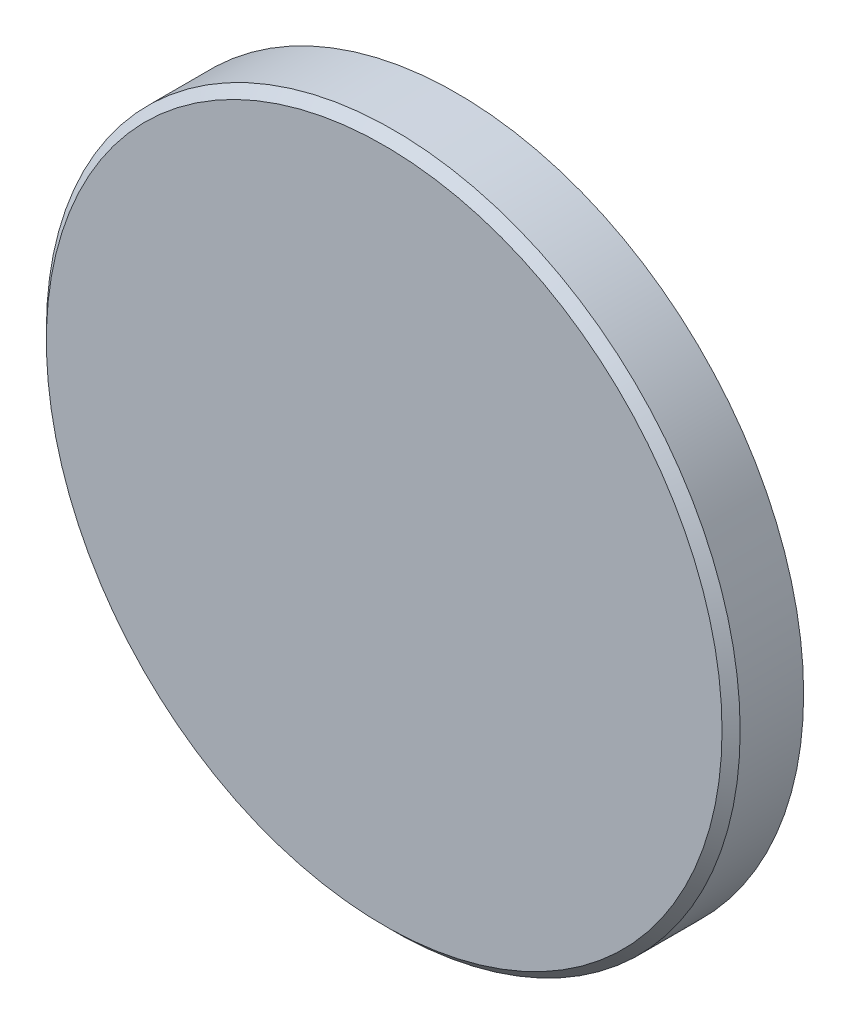
ISO-10303-21;
HEADER;
FILE_DESCRIPTION(('STEP AP214'),'2;1');
FILE_NAME('part.step','',(''),(''),'','','');
FILE_SCHEMA(('AUTOMOTIVE_DESIGN { 1 0 10303 214 1 1 1 1 }'));
ENDSEC;
DATA;
#1=APPLICATION_CONTEXT('core data for automotive mechanical design processes');
#2=APPLICATION_PROTOCOL_DEFINITION('international standard','automotive_design',2000,#1);
#3=PRODUCT_CONTEXT('',#1,'mechanical');
#4=PRODUCT('Part','Part','',(#3));
#5=PRODUCT_RELATED_PRODUCT_CATEGORY('part','',(#4));
#6=PRODUCT_DEFINITION_FORMATION('','',#4);
#7=PRODUCT_DEFINITION_CONTEXT('part definition',#1,'design');
#8=PRODUCT_DEFINITION('design','',#6,#7);
#9=PRODUCT_DEFINITION_SHAPE('','',#8);
#10=(LENGTH_UNIT() NAMED_UNIT(*) SI_UNIT(.MILLI.,.METRE.));
#11=(NAMED_UNIT(*) PLANE_ANGLE_UNIT() SI_UNIT($,.RADIAN.));
#12=(NAMED_UNIT(*) SI_UNIT($,.STERADIAN.) SOLID_ANGLE_UNIT());
#13=UNCERTAINTY_MEASURE_WITH_UNIT(LENGTH_MEASURE(1.E-05),#10,'distance_accuracy_value','');
#14=(GEOMETRIC_REPRESENTATION_CONTEXT(3) GLOBAL_UNCERTAINTY_ASSIGNED_CONTEXT((#13)) GLOBAL_UNIT_ASSIGNED_CONTEXT((#10,
#11,#12)) REPRESENTATION_CONTEXT('',''));
#15=CARTESIAN_POINT('',(0.,0.,0.));
#16=DIRECTION('',(0.,0.,1.));
#17=DIRECTION('',(1.,0.,0.));
#18=AXIS2_PLACEMENT_3D('',#15,#16,#17);
#19=CARTESIAN_POINT('',(0.,0.,-2.));
#20=DIRECTION('',(0.,0.,1.));
#21=DIRECTION('',(1.,0.,0.));
#22=AXIS2_PLACEMENT_3D('',#19,#20,#21);
#23=CYLINDRICAL_SURFACE('',#22,9.564659965);
#24=CARTESIAN_POINT('',(0.,0.,-0.250000000000005));
#25=DIRECTION('',(0.,0.,1.));
#26=DIRECTION('',(1.,0.,0.));
#27=AXIS2_PLACEMENT_3D('',#24,#25,#26);
#28=CIRCLE('',#27,9.564659965);
#29=CARTESIAN_POINT('',(9.564659965,0.,-0.250000000000005));
#30=VERTEX_POINT('',#29);
#31=EDGE_CURVE('E10',#30,#30,#28,.F.);
#32=ORIENTED_EDGE('',*,*,#31,.T.);
#33=EDGE_LOOP('',(#32));
#34=FACE_BOUND('',#33,.T.);
#35=CARTESIAN_POINT('',(0.,0.,-2.));
#36=DIRECTION('',(0.,0.,1.));
#37=DIRECTION('',(1.,0.,0.));
#38=AXIS2_PLACEMENT_3D('',#35,#36,#37);
#39=CIRCLE('',#38,9.564659965);
#40=CARTESIAN_POINT('',(9.564659965,0.,-2.));
#41=VERTEX_POINT('',#40);
#42=EDGE_CURVE('E51',#41,#41,#39,.T.);
#43=ORIENTED_EDGE('',*,*,#42,.T.);
#44=EDGE_LOOP('',(#43));
#45=FACE_BOUND('',#44,.T.);
#46=ADVANCED_FACE('F39',(#34,#45),#23,.T.);
#47=CARTESIAN_POINT('',(0.,0.,-2.));
#48=DIRECTION('',(0.,0.,1.));
#49=DIRECTION('',(1.,0.,0.));
#50=AXIS2_PLACEMENT_3D('',#47,#48,#49);
#51=PLANE('',#50);
#52=ORIENTED_EDGE('',*,*,#42,.F.);
#53=EDGE_LOOP('',(#52));
#54=FACE_BOUND('',#53,.T.);
#55=ADVANCED_FACE('F59',(#54),#51,.F.);
#56=CARTESIAN_POINT('',(0.,0.,0.));
#57=DIRECTION('',(0.,0.,1.));
#58=DIRECTION('',(1.,0.,0.));
#59=AXIS2_PLACEMENT_3D('',#56,#57,#58);
#60=PLANE('',#59);
#61=CARTESIAN_POINT('',(0.,0.,0.));
#62=DIRECTION('',(0.,0.,1.));
#63=DIRECTION('',(1.,0.,0.));
#64=AXIS2_PLACEMENT_3D('',#61,#62,#63);
#65=CIRCLE('',#64,9.314659965);
#66=CARTESIAN_POINT('',(9.314659965,0.,0.));
#67=VERTEX_POINT('',#66);
#68=EDGE_CURVE('E47',#67,#67,#65,.T.);
#69=ORIENTED_EDGE('',*,*,#68,.T.);
#70=EDGE_LOOP('',(#69));
#71=FACE_BOUND('',#70,.T.);
#72=ADVANCED_FACE('F61',(#71),#60,.T.);
#73=CARTESIAN_POINT('',(0.,0.,0.));
#74=DIRECTION('',(0.,0.,-1.));
#75=DIRECTION('',(-1.,0.,0.));
#76=AXIS2_PLACEMENT_3D('',#73,#74,#75);
#77=CONICAL_SURFACE('',#76,9.314659965,0.785398163397445);
#78=ORIENTED_EDGE('',*,*,#31,.F.);
#79=EDGE_LOOP('',(#78));
#80=FACE_BOUND('',#79,.T.);
#81=ORIENTED_EDGE('',*,*,#68,.F.);
#82=EDGE_LOOP('',(#81));
#83=FACE_BOUND('',#82,.T.);
#84=ADVANCED_FACE('F42',(#80,#83),#77,.T.);
#85=CLOSED_SHELL('',(#46,#55,#72,#84));
#86=MANIFOLD_SOLID_BREP('B2',#85);
#87=ADVANCED_BREP_SHAPE_REPRESENTATION('',(#18,#86),#14);
#88=SHAPE_DEFINITION_REPRESENTATION(#9,#87);
ENDSEC;
END-ISO-10303-21;
